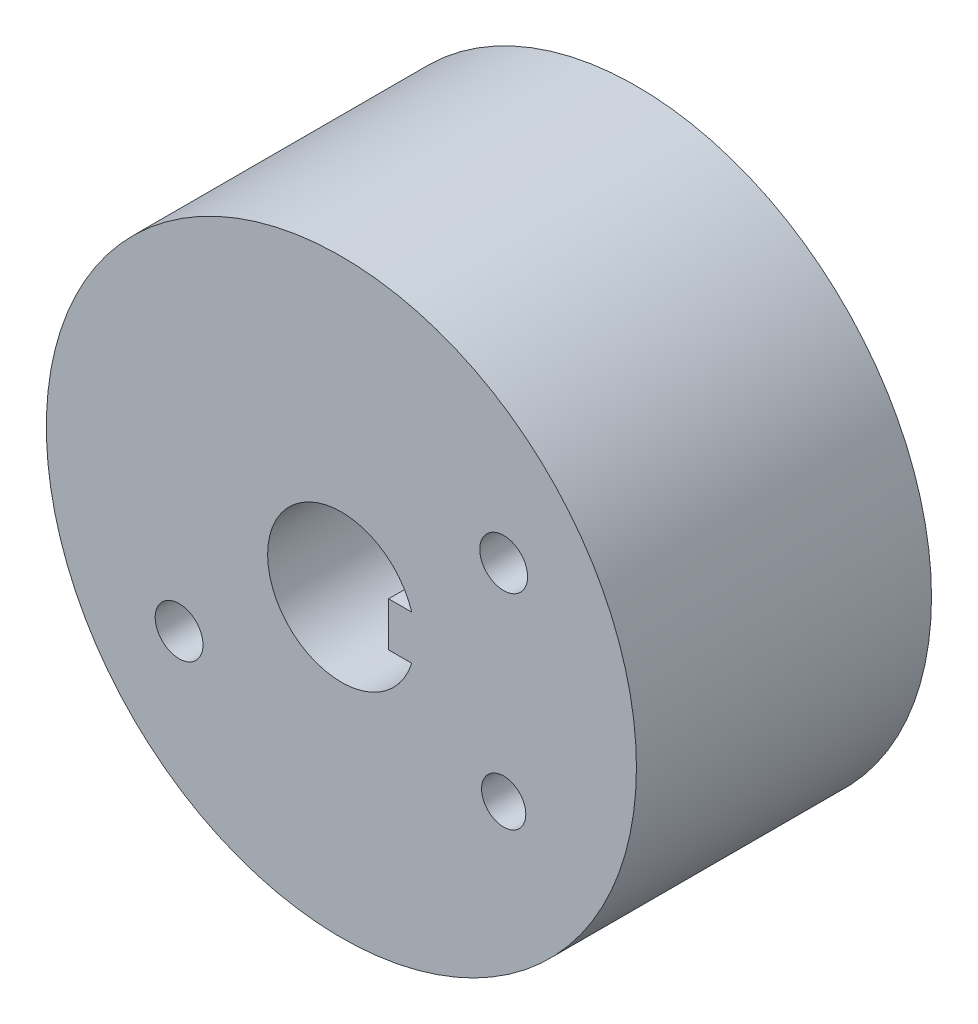
ISO-10303-21;
HEADER;
FILE_DESCRIPTION(('STEP AP214'),'2;1');
FILE_NAME('part.step','',(''),(''),'','','');
FILE_SCHEMA(('AUTOMOTIVE_DESIGN { 1 0 10303 214 1 1 1 1 }'));
ENDSEC;
DATA;
#1=APPLICATION_CONTEXT('core data for automotive mechanical design processes');
#2=APPLICATION_PROTOCOL_DEFINITION('international standard','automotive_design',2000,#1);
#3=PRODUCT_CONTEXT('',#1,'mechanical');
#4=PRODUCT('Part','Part','',(#3));
#5=PRODUCT_RELATED_PRODUCT_CATEGORY('part','',(#4));
#6=PRODUCT_DEFINITION_FORMATION('','',#4);
#7=PRODUCT_DEFINITION_CONTEXT('part definition',#1,'design');
#8=PRODUCT_DEFINITION('design','',#6,#7);
#9=PRODUCT_DEFINITION_SHAPE('','',#8);
#10=(LENGTH_UNIT() NAMED_UNIT(*) SI_UNIT(.MILLI.,.METRE.));
#11=(NAMED_UNIT(*) PLANE_ANGLE_UNIT() SI_UNIT($,.RADIAN.));
#12=(NAMED_UNIT(*) SI_UNIT($,.STERADIAN.) SOLID_ANGLE_UNIT());
#13=UNCERTAINTY_MEASURE_WITH_UNIT(LENGTH_MEASURE(1.E-05),#10,'distance_accuracy_value','');
#14=(GEOMETRIC_REPRESENTATION_CONTEXT(3) GLOBAL_UNCERTAINTY_ASSIGNED_CONTEXT((#13)) GLOBAL_UNIT_ASSIGNED_CONTEXT((#10,
#11,#12)) REPRESENTATION_CONTEXT('',''));
#15=CARTESIAN_POINT('',(0.,0.,0.));
#16=DIRECTION('',(0.,0.,1.));
#17=DIRECTION('',(1.,0.,0.));
#18=AXIS2_PLACEMENT_3D('',#15,#16,#17);
#19=CARTESIAN_POINT('',(0.,0.,20.));
#20=DIRECTION('',(0.,0.,-1.));
#21=DIRECTION('',(-1.,0.,0.));
#22=AXIS2_PLACEMENT_3D('',#19,#20,#21);
#23=CYLINDRICAL_SURFACE('',#22,20.);
#24=CARTESIAN_POINT('',(0.,0.,20.));
#25=DIRECTION('',(0.,0.,1.));
#26=DIRECTION('',(1.,0.,0.));
#27=AXIS2_PLACEMENT_3D('',#24,#25,#26);
#28=CIRCLE('',#27,20.);
#29=CARTESIAN_POINT('',(20.,0.,20.));
#30=VERTEX_POINT('',#29);
#31=EDGE_CURVE('E103',#30,#30,#28,.T.);
#32=ORIENTED_EDGE('',*,*,#31,.F.);
#33=EDGE_LOOP('',(#32));
#34=FACE_BOUND('',#33,.T.);
#35=CARTESIAN_POINT('',(0.,0.,0.));
#36=DIRECTION('',(0.,0.,1.));
#37=DIRECTION('',(1.,0.,0.));
#38=AXIS2_PLACEMENT_3D('',#35,#36,#37);
#39=CIRCLE('',#38,20.);
#40=CARTESIAN_POINT('',(20.,0.,0.));
#41=VERTEX_POINT('',#40);
#42=EDGE_CURVE('E100',#41,#41,#39,.T.);
#43=ORIENTED_EDGE('',*,*,#42,.T.);
#44=EDGE_LOOP('',(#43));
#45=FACE_BOUND('',#44,.T.);
#46=ADVANCED_FACE('F32',(#34,#45),#23,.T.);
#47=CARTESIAN_POINT('',(0.,0.,20.));
#48=DIRECTION('',(0.,0.,1.));
#49=DIRECTION('',(1.,0.,0.));
#50=AXIS2_PLACEMENT_3D('',#47,#48,#49);
#51=PLANE('',#50);
#52=CARTESIAN_POINT('',(-11.0000000000001,-7.49999999999992,20.));
#53=DIRECTION('',(0.,0.,1.));
#54=DIRECTION('',(1.,0.,0.));
#55=AXIS2_PLACEMENT_3D('',#52,#53,#54);
#56=CIRCLE('',#55,1.62);
#57=CARTESIAN_POINT('',(-9.38000000000005,-7.49999999999992,20.));
#58=VERTEX_POINT('',#57);
#59=EDGE_CURVE('E126',#58,#58,#56,.T.);
#60=ORIENTED_EDGE('',*,*,#59,.F.);
#61=EDGE_LOOP('',(#60));
#62=FACE_BOUND('',#61,.T.);
#63=CARTESIAN_POINT('',(11.,7.5,20.));
#64=DIRECTION('',(0.,0.,1.));
#65=DIRECTION('',(1.,0.,0.));
#66=AXIS2_PLACEMENT_3D('',#63,#64,#65);
#67=CIRCLE('',#66,1.62);
#68=CARTESIAN_POINT('',(12.62,7.5,20.));
#69=VERTEX_POINT('',#68);
#70=EDGE_CURVE('E125',#69,#69,#67,.T.);
#71=ORIENTED_EDGE('',*,*,#70,.F.);
#72=EDGE_LOOP('',(#71));
#73=FACE_BOUND('',#72,.T.);
#74=CARTESIAN_POINT('',(11.,-6.50000000000008,20.));
#75=DIRECTION('',(0.,0.,1.));
#76=DIRECTION('',(1.,0.,0.));
#77=AXIS2_PLACEMENT_3D('',#74,#75,#76);
#78=CIRCLE('',#77,1.5);
#79=CARTESIAN_POINT('',(12.5,-6.50000000000008,20.));
#80=VERTEX_POINT('',#79);
#81=EDGE_CURVE('E115',#80,#80,#78,.T.);
#82=ORIENTED_EDGE('',*,*,#81,.F.);
#83=EDGE_LOOP('',(#82));
#84=FACE_BOUND('',#83,.T.);
#85=DIRECTION('',(0.,1.,0.));
#86=VECTOR('',#85,1.);
#87=CARTESIAN_POINT('',(3.2,0.,20.));
#88=LINE('',#87,#86);
#89=CARTESIAN_POINT('',(3.2,-1.5,20.));
#90=VERTEX_POINT('',#89);
#91=CARTESIAN_POINT('',(3.2,1.5,20.));
#92=VERTEX_POINT('',#91);
#93=EDGE_CURVE('E48',#90,#92,#88,.T.);
#94=ORIENTED_EDGE('',*,*,#93,.F.);
#95=DIRECTION('',(1.,0.,0.));
#96=VECTOR('',#95,1.);
#97=CARTESIAN_POINT('',(0.,-1.5,20.));
#98=LINE('',#97,#96);
#99=CARTESIAN_POINT('',(4.76969600708473,-1.5,20.));
#100=VERTEX_POINT('',#99);
#101=EDGE_CURVE('E93',#90,#100,#98,.T.);
#102=ORIENTED_EDGE('',*,*,#101,.T.);
#103=CARTESIAN_POINT('',(0.,0.,20.));
#104=DIRECTION('',(0.,0.,1.));
#105=DIRECTION('',(1.,0.,0.));
#106=AXIS2_PLACEMENT_3D('',#103,#104,#105);
#107=CIRCLE('',#106,5.);
#108=CARTESIAN_POINT('',(4.76969600708473,1.5,20.));
#109=VERTEX_POINT('',#108);
#110=EDGE_CURVE('E77',#109,#100,#107,.T.);
#111=ORIENTED_EDGE('',*,*,#110,.F.);
#112=DIRECTION('',(1.,0.,0.));
#113=VECTOR('',#112,1.);
#114=CARTESIAN_POINT('',(0.,1.5,20.));
#115=LINE('',#114,#113);
#116=EDGE_CURVE('E86',#92,#109,#115,.T.);
#117=ORIENTED_EDGE('',*,*,#116,.F.);
#118=EDGE_LOOP('',(#94,#102,#111,#117));
#119=FACE_BOUND('',#118,.T.);
#120=ORIENTED_EDGE('',*,*,#31,.T.);
#121=EDGE_LOOP('',(#120));
#122=FACE_BOUND('',#121,.T.);
#123=ADVANCED_FACE('F90',(#62,#73,#84,#119,#122),#51,.T.);
#124=CARTESIAN_POINT('',(0.,0.,0.));
#125=DIRECTION('',(0.,0.,1.));
#126=DIRECTION('',(1.,0.,0.));
#127=AXIS2_PLACEMENT_3D('',#124,#125,#126);
#128=PLANE('',#127);
#129=CARTESIAN_POINT('',(-11.0000000000001,-7.49999999999992,0.));
#130=DIRECTION('',(0.,0.,1.));
#131=DIRECTION('',(1.,0.,0.));
#132=AXIS2_PLACEMENT_3D('',#129,#130,#131);
#133=CIRCLE('',#132,1.62);
#134=CARTESIAN_POINT('',(-9.38000000000005,-7.49999999999992,0.));
#135=VERTEX_POINT('',#134);
#136=EDGE_CURVE('E35',#135,#135,#133,.T.);
#137=ORIENTED_EDGE('',*,*,#136,.T.);
#138=EDGE_LOOP('',(#137));
#139=FACE_BOUND('',#138,.T.);
#140=CARTESIAN_POINT('',(11.,7.5,0.));
#141=DIRECTION('',(0.,0.,1.));
#142=DIRECTION('',(1.,0.,0.));
#143=AXIS2_PLACEMENT_3D('',#140,#141,#142);
#144=CIRCLE('',#143,1.62);
#145=CARTESIAN_POINT('',(12.62,7.5,0.));
#146=VERTEX_POINT('',#145);
#147=EDGE_CURVE('E114',#146,#146,#144,.T.);
#148=ORIENTED_EDGE('',*,*,#147,.T.);
#149=EDGE_LOOP('',(#148));
#150=FACE_BOUND('',#149,.T.);
#151=CARTESIAN_POINT('',(11.,-6.50000000000008,0.));
#152=DIRECTION('',(0.,0.,1.));
#153=DIRECTION('',(1.,0.,0.));
#154=AXIS2_PLACEMENT_3D('',#151,#152,#153);
#155=CIRCLE('',#154,1.5);
#156=CARTESIAN_POINT('',(12.5,-6.50000000000008,0.));
#157=VERTEX_POINT('',#156);
#158=EDGE_CURVE('E112',#157,#157,#155,.T.);
#159=ORIENTED_EDGE('',*,*,#158,.T.);
#160=EDGE_LOOP('',(#159));
#161=FACE_BOUND('',#160,.T.);
#162=DIRECTION('',(1.,0.,0.));
#163=VECTOR('',#162,1.);
#164=CARTESIAN_POINT('',(0.,-1.5,0.));
#165=LINE('',#164,#163);
#166=CARTESIAN_POINT('',(3.2,-1.5,0.));
#167=VERTEX_POINT('',#166);
#168=CARTESIAN_POINT('',(4.76969600708473,-1.5,0.));
#169=VERTEX_POINT('',#168);
#170=EDGE_CURVE('E40',#167,#169,#165,.T.);
#171=ORIENTED_EDGE('',*,*,#170,.F.);
#172=DIRECTION('',(0.,1.,0.));
#173=VECTOR('',#172,1.);
#174=CARTESIAN_POINT('',(3.2,0.,0.));
#175=LINE('',#174,#173);
#176=CARTESIAN_POINT('',(3.2,1.5,0.));
#177=VERTEX_POINT('',#176);
#178=EDGE_CURVE('E11',#167,#177,#175,.T.);
#179=ORIENTED_EDGE('',*,*,#178,.T.);
#180=DIRECTION('',(1.,0.,0.));
#181=VECTOR('',#180,1.);
#182=CARTESIAN_POINT('',(0.,1.5,0.));
#183=LINE('',#182,#181);
#184=CARTESIAN_POINT('',(4.76969600708473,1.5,0.));
#185=VERTEX_POINT('',#184);
#186=EDGE_CURVE('E106',#177,#185,#183,.T.);
#187=ORIENTED_EDGE('',*,*,#186,.T.);
#188=CARTESIAN_POINT('',(0.,0.,0.));
#189=DIRECTION('',(0.,0.,1.));
#190=DIRECTION('',(1.,0.,0.));
#191=AXIS2_PLACEMENT_3D('',#188,#189,#190);
#192=CIRCLE('',#191,5.);
#193=EDGE_CURVE('E80',#185,#169,#192,.T.);
#194=ORIENTED_EDGE('',*,*,#193,.T.);
#195=EDGE_LOOP('',(#171,#179,#187,#194));
#196=FACE_BOUND('',#195,.T.);
#197=ORIENTED_EDGE('',*,*,#42,.F.);
#198=EDGE_LOOP('',(#197));
#199=FACE_BOUND('',#198,.T.);
#200=ADVANCED_FACE('F137',(#139,#150,#161,#196,#199),#128,.F.);
#201=CARTESIAN_POINT('',(3.2,0.,-2.5));
#202=DIRECTION('',(1.,0.,0.));
#203=DIRECTION('',(0.,0.,-1.));
#204=AXIS2_PLACEMENT_3D('',#201,#202,#203);
#205=PLANE('',#204);
#206=DIRECTION('',(0.,0.,1.));
#207=VECTOR('',#206,1.);
#208=CARTESIAN_POINT('',(3.2,-1.5,-2.5));
#209=LINE('',#208,#207);
#210=EDGE_CURVE('E98',#167,#90,#209,.T.);
#211=ORIENTED_EDGE('',*,*,#210,.T.);
#212=ORIENTED_EDGE('',*,*,#93,.T.);
#213=DIRECTION('',(0.,0.,1.));
#214=VECTOR('',#213,1.);
#215=CARTESIAN_POINT('',(3.2,1.5,-2.5));
#216=LINE('',#215,#214);
#217=EDGE_CURVE('E83',#177,#92,#216,.T.);
#218=ORIENTED_EDGE('',*,*,#217,.F.);
#219=ORIENTED_EDGE('',*,*,#178,.F.);
#220=EDGE_LOOP('',(#211,#212,#218,#219));
#221=FACE_BOUND('',#220,.T.);
#222=ADVANCED_FACE('F150',(#221),#205,.F.);
#223=CARTESIAN_POINT('',(0.,-1.5,-2.5));
#224=DIRECTION('',(0.,-1.,0.));
#225=DIRECTION('',(0.,0.,-1.));
#226=AXIS2_PLACEMENT_3D('',#223,#224,#225);
#227=PLANE('',#226);
#228=ORIENTED_EDGE('',*,*,#170,.T.);
#229=DIRECTION('',(0.,0.,1.));
#230=VECTOR('',#229,1.);
#231=CARTESIAN_POINT('',(4.76969600708473,-1.5,-2.5));
#232=LINE('',#231,#230);
#233=EDGE_CURVE('E82',#169,#100,#232,.T.);
#234=ORIENTED_EDGE('',*,*,#233,.T.);
#235=ORIENTED_EDGE('',*,*,#101,.F.);
#236=ORIENTED_EDGE('',*,*,#210,.F.);
#237=EDGE_LOOP('',(#228,#234,#235,#236));
#238=FACE_BOUND('',#237,.T.);
#239=ADVANCED_FACE('F176',(#238),#227,.T.);
#240=CARTESIAN_POINT('',(0.,0.,-2.5));
#241=DIRECTION('',(0.,0.,1.));
#242=DIRECTION('',(1.,0.,0.));
#243=AXIS2_PLACEMENT_3D('',#240,#241,#242);
#244=CYLINDRICAL_SURFACE('',#243,5.);
#245=DIRECTION('',(0.,0.,1.));
#246=VECTOR('',#245,1.);
#247=CARTESIAN_POINT('',(4.76969600708473,1.5,-2.5));
#248=LINE('',#247,#246);
#249=EDGE_CURVE('E56',#185,#109,#248,.T.);
#250=ORIENTED_EDGE('',*,*,#249,.T.);
#251=ORIENTED_EDGE('',*,*,#110,.T.);
#252=ORIENTED_EDGE('',*,*,#233,.F.);
#253=ORIENTED_EDGE('',*,*,#193,.F.);
#254=EDGE_LOOP('',(#250,#251,#252,#253));
#255=FACE_BOUND('',#254,.T.);
#256=ADVANCED_FACE('F74',(#255),#244,.F.);
#257=CARTESIAN_POINT('',(0.,1.5,-2.5));
#258=DIRECTION('',(0.,-1.,0.));
#259=DIRECTION('',(0.,0.,-1.));
#260=AXIS2_PLACEMENT_3D('',#257,#258,#259);
#261=PLANE('',#260);
#262=ORIENTED_EDGE('',*,*,#217,.T.);
#263=ORIENTED_EDGE('',*,*,#116,.T.);
#264=ORIENTED_EDGE('',*,*,#249,.F.);
#265=ORIENTED_EDGE('',*,*,#186,.F.);
#266=EDGE_LOOP('',(#262,#263,#264,#265));
#267=FACE_BOUND('',#266,.T.);
#268=ADVANCED_FACE('F87',(#267),#261,.F.);
#269=CARTESIAN_POINT('',(11.,-6.50000000000008,-2.5));
#270=DIRECTION('',(0.,0.,1.));
#271=DIRECTION('',(1.,0.,0.));
#272=AXIS2_PLACEMENT_3D('',#269,#270,#271);
#273=CYLINDRICAL_SURFACE('',#272,1.5);
#274=CARTESIAN_POINT('',(12.5,-6.50000000000008,20.));
#275=CARTESIAN_POINT('',(12.5,-6.50000000000008,19.7916666666667));
#276=CARTESIAN_POINT('',(12.5,-6.50000000000008,19.5833333333333));
#277=CARTESIAN_POINT('',(12.5,-6.50000000000008,19.1666666666667));
#278=CARTESIAN_POINT('',(12.5,-6.50000000000008,18.9583333333333));
#279=CARTESIAN_POINT('',(12.5,-6.50000000000008,18.5416666666667));
#280=CARTESIAN_POINT('',(12.5,-6.50000000000008,18.3333333333333));
#281=CARTESIAN_POINT('',(12.5,-6.50000000000008,17.9166666666667));
#282=CARTESIAN_POINT('',(12.5,-6.50000000000008,17.7083333333333));
#283=CARTESIAN_POINT('',(12.5,-6.50000000000008,17.2916666666667));
#284=CARTESIAN_POINT('',(12.5,-6.50000000000008,17.0833333333333));
#285=CARTESIAN_POINT('',(12.5,-6.50000000000008,16.6666666666667));
#286=CARTESIAN_POINT('',(12.5,-6.50000000000008,16.4583333333333));
#287=CARTESIAN_POINT('',(12.5,-6.50000000000008,16.0416666666667));
#288=CARTESIAN_POINT('',(12.5,-6.50000000000008,15.8333333333333));
#289=CARTESIAN_POINT('',(12.5,-6.50000000000008,15.4166666666667));
#290=CARTESIAN_POINT('',(12.5,-6.50000000000008,15.2083333333333));
#291=CARTESIAN_POINT('',(12.5,-6.50000000000008,14.7916666666667));
#292=CARTESIAN_POINT('',(12.5,-6.50000000000008,14.5833333333333));
#293=CARTESIAN_POINT('',(12.5,-6.50000000000008,14.1666666666667));
#294=CARTESIAN_POINT('',(12.5,-6.50000000000008,13.9583333333333));
#295=CARTESIAN_POINT('',(12.5,-6.50000000000008,13.5416666666667));
#296=CARTESIAN_POINT('',(12.5,-6.50000000000008,13.3333333333333));
#297=CARTESIAN_POINT('',(12.5,-6.50000000000008,12.9166666666667));
#298=CARTESIAN_POINT('',(12.5,-6.50000000000008,12.7083333333333));
#299=CARTESIAN_POINT('',(12.5,-6.50000000000008,12.2916666666667));
#300=CARTESIAN_POINT('',(12.5,-6.50000000000008,12.0833333333333));
#301=CARTESIAN_POINT('',(12.5,-6.50000000000008,11.6666666666667));
#302=CARTESIAN_POINT('',(12.5,-6.50000000000008,11.4583333333333));
#303=CARTESIAN_POINT('',(12.5,-6.50000000000008,11.0416666666667));
#304=CARTESIAN_POINT('',(12.5,-6.50000000000008,10.8333333333333));
#305=CARTESIAN_POINT('',(12.5,-6.50000000000008,10.4166666666667));
#306=CARTESIAN_POINT('',(12.5,-6.50000000000008,10.2083333333333));
#307=CARTESIAN_POINT('',(12.5,-6.50000000000008,9.79166666666667));
#308=CARTESIAN_POINT('',(12.5,-6.50000000000008,9.58333333333333));
#309=CARTESIAN_POINT('',(12.5,-6.50000000000008,9.16666666666666));
#310=CARTESIAN_POINT('',(12.5,-6.50000000000008,8.95833333333333));
#311=CARTESIAN_POINT('',(12.5,-6.50000000000008,8.54166666666667));
#312=CARTESIAN_POINT('',(12.5,-6.50000000000008,8.33333333333333));
#313=CARTESIAN_POINT('',(12.5,-6.50000000000008,7.91666666666667));
#314=CARTESIAN_POINT('',(12.5,-6.50000000000008,7.70833333333333));
#315=CARTESIAN_POINT('',(12.5,-6.50000000000008,7.29166666666667));
#316=CARTESIAN_POINT('',(12.5,-6.50000000000008,7.08333333333333));
#317=CARTESIAN_POINT('',(12.5,-6.50000000000008,6.66666666666667));
#318=CARTESIAN_POINT('',(12.5,-6.50000000000008,6.45833333333333));
#319=CARTESIAN_POINT('',(12.5,-6.50000000000008,6.04166666666667));
#320=CARTESIAN_POINT('',(12.5,-6.50000000000008,5.83333333333333));
#321=CARTESIAN_POINT('',(12.5,-6.50000000000008,5.41666666666667));
#322=CARTESIAN_POINT('',(12.5,-6.50000000000008,5.20833333333333));
#323=CARTESIAN_POINT('',(12.5,-6.50000000000008,4.79166666666667));
#324=CARTESIAN_POINT('',(12.5,-6.50000000000008,4.58333333333333));
#325=CARTESIAN_POINT('',(12.5,-6.50000000000008,4.16666666666667));
#326=CARTESIAN_POINT('',(12.5,-6.50000000000008,3.95833333333333));
#327=CARTESIAN_POINT('',(12.5,-6.50000000000008,3.54166666666667));
#328=CARTESIAN_POINT('',(12.5,-6.50000000000008,3.33333333333333));
#329=CARTESIAN_POINT('',(12.5,-6.50000000000008,2.91666666666667));
#330=CARTESIAN_POINT('',(12.5,-6.50000000000008,2.70833333333333));
#331=CARTESIAN_POINT('',(12.5,-6.50000000000008,2.29166666666667));
#332=CARTESIAN_POINT('',(12.5,-6.50000000000008,2.08333333333333));
#333=CARTESIAN_POINT('',(12.5,-6.50000000000008,1.66666666666667));
#334=CARTESIAN_POINT('',(12.5,-6.50000000000008,1.45833333333333));
#335=CARTESIAN_POINT('',(12.5,-6.50000000000008,1.04166666666667));
#336=CARTESIAN_POINT('',(12.5,-6.50000000000008,0.833333333333333));
#337=CARTESIAN_POINT('',(12.5,-6.50000000000008,0.416666666666667));
#338=CARTESIAN_POINT('',(12.5,-6.50000000000008,0.208333333333333));
#339=CARTESIAN_POINT('',(12.5,-6.50000000000008,0.));
#340=B_SPLINE_CURVE_WITH_KNOTS('',3,(#274,#275,#276,#277,#278,#279,#280,#281,#282,#283,#284,
#285,#286,#287,#288,#289,#290,#291,#292,#293,#294,#295,#296,#297,#298,#299,#300,#301,#302,#303,
#304,#305,#306,#307,#308,#309,#310,#311,#312,#313,#314,#315,#316,#317,#318,#319,#320,#321,#322,
#323,#324,#325,#326,#327,#328,#329,#330,#331,#332,#333,#334,#335,#336,#337,#338,#339),
.UNSPECIFIED.,.F.,.F.,(4,2,2,2,2,2,2,2,2,2,2,2,2,2,2,2,2,2,2,2,2,2,2,2,2,2,2,2,2,2,2,2,4),(0.,
0.625000000000001,1.25,1.875,2.5,3.125,3.75,4.375,5.,5.625,6.25,6.875,7.5,8.125,8.75,9.375,10.,
10.625,11.25,11.875,12.5,13.125,13.75,14.375,15.,15.625,16.25,16.875,17.5,18.125,18.75,19.375,
20.),.UNSPECIFIED.);
#341=EDGE_CURVE('BSEAM142',#80,#157,#340,.T.);
#342=ORIENTED_EDGE('',*,*,#81,.T.);
#343=ORIENTED_EDGE('',*,*,#158,.F.);
#344=ORIENTED_EDGE('',*,*,#341,.T.);
#345=ORIENTED_EDGE('',*,*,#341,.F.);
#346=EDGE_LOOP('',(#342,#344,#343,#345));
#347=FACE_BOUND('',#346,.T.);
#348=ADVANCED_FACE('F142',(#347),#273,.F.);
#349=CARTESIAN_POINT('',(11.,7.5,-2.5));
#350=DIRECTION('',(0.,0.,1.));
#351=DIRECTION('',(1.,0.,0.));
#352=AXIS2_PLACEMENT_3D('',#349,#350,#351);
#353=CYLINDRICAL_SURFACE('',#352,1.62);
#354=CARTESIAN_POINT('',(12.62,7.5,20.));
#355=CARTESIAN_POINT('',(12.62,7.5,19.7916666666667));
#356=CARTESIAN_POINT('',(12.62,7.5,19.5833333333333));
#357=CARTESIAN_POINT('',(12.62,7.5,19.1666666666667));
#358=CARTESIAN_POINT('',(12.62,7.5,18.9583333333333));
#359=CARTESIAN_POINT('',(12.62,7.5,18.5416666666667));
#360=CARTESIAN_POINT('',(12.62,7.5,18.3333333333333));
#361=CARTESIAN_POINT('',(12.62,7.5,17.9166666666667));
#362=CARTESIAN_POINT('',(12.62,7.5,17.7083333333333));
#363=CARTESIAN_POINT('',(12.62,7.5,17.2916666666667));
#364=CARTESIAN_POINT('',(12.62,7.5,17.0833333333333));
#365=CARTESIAN_POINT('',(12.62,7.5,16.6666666666667));
#366=CARTESIAN_POINT('',(12.62,7.5,16.4583333333333));
#367=CARTESIAN_POINT('',(12.62,7.5,16.0416666666667));
#368=CARTESIAN_POINT('',(12.62,7.5,15.8333333333333));
#369=CARTESIAN_POINT('',(12.62,7.5,15.4166666666667));
#370=CARTESIAN_POINT('',(12.62,7.5,15.2083333333333));
#371=CARTESIAN_POINT('',(12.62,7.5,14.7916666666667));
#372=CARTESIAN_POINT('',(12.62,7.5,14.5833333333333));
#373=CARTESIAN_POINT('',(12.62,7.5,14.1666666666667));
#374=CARTESIAN_POINT('',(12.62,7.5,13.9583333333333));
#375=CARTESIAN_POINT('',(12.62,7.5,13.5416666666667));
#376=CARTESIAN_POINT('',(12.62,7.5,13.3333333333333));
#377=CARTESIAN_POINT('',(12.62,7.5,12.9166666666667));
#378=CARTESIAN_POINT('',(12.62,7.5,12.7083333333333));
#379=CARTESIAN_POINT('',(12.62,7.5,12.2916666666667));
#380=CARTESIAN_POINT('',(12.62,7.5,12.0833333333333));
#381=CARTESIAN_POINT('',(12.62,7.5,11.6666666666667));
#382=CARTESIAN_POINT('',(12.62,7.5,11.4583333333333));
#383=CARTESIAN_POINT('',(12.62,7.5,11.0416666666667));
#384=CARTESIAN_POINT('',(12.62,7.5,10.8333333333333));
#385=CARTESIAN_POINT('',(12.62,7.5,10.4166666666667));
#386=CARTESIAN_POINT('',(12.62,7.5,10.2083333333333));
#387=CARTESIAN_POINT('',(12.62,7.5,9.79166666666667));
#388=CARTESIAN_POINT('',(12.62,7.5,9.58333333333333));
#389=CARTESIAN_POINT('',(12.62,7.5,9.16666666666666));
#390=CARTESIAN_POINT('',(12.62,7.5,8.95833333333333));
#391=CARTESIAN_POINT('',(12.62,7.5,8.54166666666667));
#392=CARTESIAN_POINT('',(12.62,7.5,8.33333333333333));
#393=CARTESIAN_POINT('',(12.62,7.5,7.91666666666667));
#394=CARTESIAN_POINT('',(12.62,7.5,7.70833333333333));
#395=CARTESIAN_POINT('',(12.62,7.5,7.29166666666667));
#396=CARTESIAN_POINT('',(12.62,7.5,7.08333333333333));
#397=CARTESIAN_POINT('',(12.62,7.5,6.66666666666667));
#398=CARTESIAN_POINT('',(12.62,7.5,6.45833333333333));
#399=CARTESIAN_POINT('',(12.62,7.5,6.04166666666667));
#400=CARTESIAN_POINT('',(12.62,7.5,5.83333333333333));
#401=CARTESIAN_POINT('',(12.62,7.5,5.41666666666667));
#402=CARTESIAN_POINT('',(12.62,7.5,5.20833333333333));
#403=CARTESIAN_POINT('',(12.62,7.5,4.79166666666667));
#404=CARTESIAN_POINT('',(12.62,7.5,4.58333333333333));
#405=CARTESIAN_POINT('',(12.62,7.5,4.16666666666667));
#406=CARTESIAN_POINT('',(12.62,7.5,3.95833333333333));
#407=CARTESIAN_POINT('',(12.62,7.5,3.54166666666667));
#408=CARTESIAN_POINT('',(12.62,7.5,3.33333333333333));
#409=CARTESIAN_POINT('',(12.62,7.5,2.91666666666667));
#410=CARTESIAN_POINT('',(12.62,7.5,2.70833333333333));
#411=CARTESIAN_POINT('',(12.62,7.5,2.29166666666667));
#412=CARTESIAN_POINT('',(12.62,7.5,2.08333333333333));
#413=CARTESIAN_POINT('',(12.62,7.5,1.66666666666667));
#414=CARTESIAN_POINT('',(12.62,7.5,1.45833333333333));
#415=CARTESIAN_POINT('',(12.62,7.5,1.04166666666667));
#416=CARTESIAN_POINT('',(12.62,7.5,0.833333333333333));
#417=CARTESIAN_POINT('',(12.62,7.5,0.416666666666667));
#418=CARTESIAN_POINT('',(12.62,7.5,0.208333333333333));
#419=CARTESIAN_POINT('',(12.62,7.5,0.));
#420=B_SPLINE_CURVE_WITH_KNOTS('',3,(#354,#355,#356,#357,#358,#359,#360,#361,#362,#363,#364,
#365,#366,#367,#368,#369,#370,#371,#372,#373,#374,#375,#376,#377,#378,#379,#380,#381,#382,#383,
#384,#385,#386,#387,#388,#389,#390,#391,#392,#393,#394,#395,#396,#397,#398,#399,#400,#401,#402,
#403,#404,#405,#406,#407,#408,#409,#410,#411,#412,#413,#414,#415,#416,#417,#418,#419),
.UNSPECIFIED.,.F.,.F.,(4,2,2,2,2,2,2,2,2,2,2,2,2,2,2,2,2,2,2,2,2,2,2,2,2,2,2,2,2,2,2,2,4),(0.,
0.625000000000001,1.25,1.875,2.5,3.125,3.75,4.375,5.,5.625,6.25,6.875,7.5,8.125,8.75,9.375,10.,
10.625,11.25,11.875,12.5,13.125,13.75,14.375,15.,15.625,16.25,16.875,17.5,18.125,18.75,19.375,
20.),.UNSPECIFIED.);
#421=EDGE_CURVE('BSEAM132',#69,#146,#420,.T.);
#422=ORIENTED_EDGE('',*,*,#70,.T.);
#423=ORIENTED_EDGE('',*,*,#147,.F.);
#424=ORIENTED_EDGE('',*,*,#421,.T.);
#425=ORIENTED_EDGE('',*,*,#421,.F.);
#426=EDGE_LOOP('',(#422,#424,#423,#425));
#427=FACE_BOUND('',#426,.T.);
#428=ADVANCED_FACE('F132',(#427),#353,.F.);
#429=CARTESIAN_POINT('',(-11.0000000000001,-7.49999999999992,-2.5));
#430=DIRECTION('',(0.,0.,1.));
#431=DIRECTION('',(1.,0.,0.));
#432=AXIS2_PLACEMENT_3D('',#429,#430,#431);
#433=CYLINDRICAL_SURFACE('',#432,1.62);
#434=CARTESIAN_POINT('',(-9.38000000000005,-7.49999999999992,20.));
#435=CARTESIAN_POINT('',(-9.38000000000005,-7.49999999999992,19.7916666666667));
#436=CARTESIAN_POINT('',(-9.38000000000005,-7.49999999999992,19.5833333333333));
#437=CARTESIAN_POINT('',(-9.38000000000005,-7.49999999999992,19.1666666666667));
#438=CARTESIAN_POINT('',(-9.38000000000005,-7.49999999999992,18.9583333333333));
#439=CARTESIAN_POINT('',(-9.38000000000005,-7.49999999999992,18.5416666666667));
#440=CARTESIAN_POINT('',(-9.38000000000005,-7.49999999999992,18.3333333333333));
#441=CARTESIAN_POINT('',(-9.38000000000005,-7.49999999999992,17.9166666666667));
#442=CARTESIAN_POINT('',(-9.38000000000005,-7.49999999999992,17.7083333333333));
#443=CARTESIAN_POINT('',(-9.38000000000005,-7.49999999999992,17.2916666666667));
#444=CARTESIAN_POINT('',(-9.38000000000005,-7.49999999999992,17.0833333333333));
#445=CARTESIAN_POINT('',(-9.38000000000005,-7.49999999999992,16.6666666666667));
#446=CARTESIAN_POINT('',(-9.38000000000005,-7.49999999999992,16.4583333333333));
#447=CARTESIAN_POINT('',(-9.38000000000005,-7.49999999999992,16.0416666666667));
#448=CARTESIAN_POINT('',(-9.38000000000005,-7.49999999999992,15.8333333333333));
#449=CARTESIAN_POINT('',(-9.38000000000005,-7.49999999999992,15.4166666666667));
#450=CARTESIAN_POINT('',(-9.38000000000005,-7.49999999999992,15.2083333333333));
#451=CARTESIAN_POINT('',(-9.38000000000005,-7.49999999999992,14.7916666666667));
#452=CARTESIAN_POINT('',(-9.38000000000005,-7.49999999999992,14.5833333333333));
#453=CARTESIAN_POINT('',(-9.38000000000005,-7.49999999999992,14.1666666666667));
#454=CARTESIAN_POINT('',(-9.38000000000005,-7.49999999999992,13.9583333333333));
#455=CARTESIAN_POINT('',(-9.38000000000005,-7.49999999999992,13.5416666666667));
#456=CARTESIAN_POINT('',(-9.38000000000005,-7.49999999999992,13.3333333333333));
#457=CARTESIAN_POINT('',(-9.38000000000005,-7.49999999999992,12.9166666666667));
#458=CARTESIAN_POINT('',(-9.38000000000005,-7.49999999999992,12.7083333333333));
#459=CARTESIAN_POINT('',(-9.38000000000005,-7.49999999999992,12.2916666666667));
#460=CARTESIAN_POINT('',(-9.38000000000005,-7.49999999999992,12.0833333333333));
#461=CARTESIAN_POINT('',(-9.38000000000005,-7.49999999999992,11.6666666666667));
#462=CARTESIAN_POINT('',(-9.38000000000005,-7.49999999999992,11.4583333333333));
#463=CARTESIAN_POINT('',(-9.38000000000005,-7.49999999999992,11.0416666666667));
#464=CARTESIAN_POINT('',(-9.38000000000005,-7.49999999999992,10.8333333333333));
#465=CARTESIAN_POINT('',(-9.38000000000005,-7.49999999999992,10.4166666666667));
#466=CARTESIAN_POINT('',(-9.38000000000005,-7.49999999999992,10.2083333333333));
#467=CARTESIAN_POINT('',(-9.38000000000005,-7.49999999999992,9.79166666666667));
#468=CARTESIAN_POINT('',(-9.38000000000005,-7.49999999999992,9.58333333333333));
#469=CARTESIAN_POINT('',(-9.38000000000005,-7.49999999999992,9.16666666666666));
#470=CARTESIAN_POINT('',(-9.38000000000005,-7.49999999999992,8.95833333333333));
#471=CARTESIAN_POINT('',(-9.38000000000005,-7.49999999999992,8.54166666666667));
#472=CARTESIAN_POINT('',(-9.38000000000005,-7.49999999999992,8.33333333333333));
#473=CARTESIAN_POINT('',(-9.38000000000005,-7.49999999999992,7.91666666666667));
#474=CARTESIAN_POINT('',(-9.38000000000005,-7.49999999999992,7.70833333333333));
#475=CARTESIAN_POINT('',(-9.38000000000005,-7.49999999999992,7.29166666666667));
#476=CARTESIAN_POINT('',(-9.38000000000005,-7.49999999999992,7.08333333333333));
#477=CARTESIAN_POINT('',(-9.38000000000005,-7.49999999999992,6.66666666666667));
#478=CARTESIAN_POINT('',(-9.38000000000005,-7.49999999999992,6.45833333333333));
#479=CARTESIAN_POINT('',(-9.38000000000005,-7.49999999999992,6.04166666666667));
#480=CARTESIAN_POINT('',(-9.38000000000005,-7.49999999999992,5.83333333333333));
#481=CARTESIAN_POINT('',(-9.38000000000005,-7.49999999999992,5.41666666666667));
#482=CARTESIAN_POINT('',(-9.38000000000005,-7.49999999999992,5.20833333333333));
#483=CARTESIAN_POINT('',(-9.38000000000005,-7.49999999999992,4.79166666666667));
#484=CARTESIAN_POINT('',(-9.38000000000005,-7.49999999999992,4.58333333333333));
#485=CARTESIAN_POINT('',(-9.38000000000005,-7.49999999999992,4.16666666666667));
#486=CARTESIAN_POINT('',(-9.38000000000005,-7.49999999999992,3.95833333333333));
#487=CARTESIAN_POINT('',(-9.38000000000005,-7.49999999999992,3.54166666666667));
#488=CARTESIAN_POINT('',(-9.38000000000005,-7.49999999999992,3.33333333333333));
#489=CARTESIAN_POINT('',(-9.38000000000005,-7.49999999999992,2.91666666666667));
#490=CARTESIAN_POINT('',(-9.38000000000005,-7.49999999999992,2.70833333333333));
#491=CARTESIAN_POINT('',(-9.38000000000005,-7.49999999999992,2.29166666666667));
#492=CARTESIAN_POINT('',(-9.38000000000005,-7.49999999999992,2.08333333333333));
#493=CARTESIAN_POINT('',(-9.38000000000005,-7.49999999999992,1.66666666666667));
#494=CARTESIAN_POINT('',(-9.38000000000005,-7.49999999999992,1.45833333333333));
#495=CARTESIAN_POINT('',(-9.38000000000005,-7.49999999999992,1.04166666666667));
#496=CARTESIAN_POINT('',(-9.38000000000005,-7.49999999999992,0.833333333333333));
#497=CARTESIAN_POINT('',(-9.38000000000005,-7.49999999999992,0.416666666666667));
#498=CARTESIAN_POINT('',(-9.38000000000005,-7.49999999999992,0.208333333333333));
#499=CARTESIAN_POINT('',(-9.38000000000005,-7.49999999999992,0.));
#500=B_SPLINE_CURVE_WITH_KNOTS('',3,(#434,#435,#436,#437,#438,#439,#440,#441,#442,#443,#444,
#445,#446,#447,#448,#449,#450,#451,#452,#453,#454,#455,#456,#457,#458,#459,#460,#461,#462,#463,
#464,#465,#466,#467,#468,#469,#470,#471,#472,#473,#474,#475,#476,#477,#478,#479,#480,#481,#482,
#483,#484,#485,#486,#487,#488,#489,#490,#491,#492,#493,#494,#495,#496,#497,#498,#499),
.UNSPECIFIED.,.F.,.F.,(4,2,2,2,2,2,2,2,2,2,2,2,2,2,2,2,2,2,2,2,2,2,2,2,2,2,2,2,2,2,2,2,4),(0.,
0.625000000000001,1.25,1.875,2.5,3.125,3.75,4.375,5.,5.625,6.25,6.875,7.5,8.125,8.75,9.375,10.,
10.625,11.25,11.875,12.5,13.125,13.75,14.375,15.,15.625,16.25,16.875,17.5,18.125,18.75,19.375,
20.),.UNSPECIFIED.);
#501=EDGE_CURVE('BSEAM204',#58,#135,#500,.T.);
#502=ORIENTED_EDGE('',*,*,#59,.T.);
#503=ORIENTED_EDGE('',*,*,#136,.F.);
#504=ORIENTED_EDGE('',*,*,#501,.T.);
#505=ORIENTED_EDGE('',*,*,#501,.F.);
#506=EDGE_LOOP('',(#502,#504,#503,#505));
#507=FACE_BOUND('',#506,.T.);
#508=ADVANCED_FACE('F204',(#507),#433,.F.);
#509=CLOSED_SHELL('',(#46,#123,#200,#222,#239,#256,#268,#348,#428,#508));
#510=MANIFOLD_SOLID_BREP('B2',#509);
#511=ADVANCED_BREP_SHAPE_REPRESENTATION('',(#18,#510),#14);
#512=SHAPE_DEFINITION_REPRESENTATION(#9,#511);
ENDSEC;
END-ISO-10303-21;
